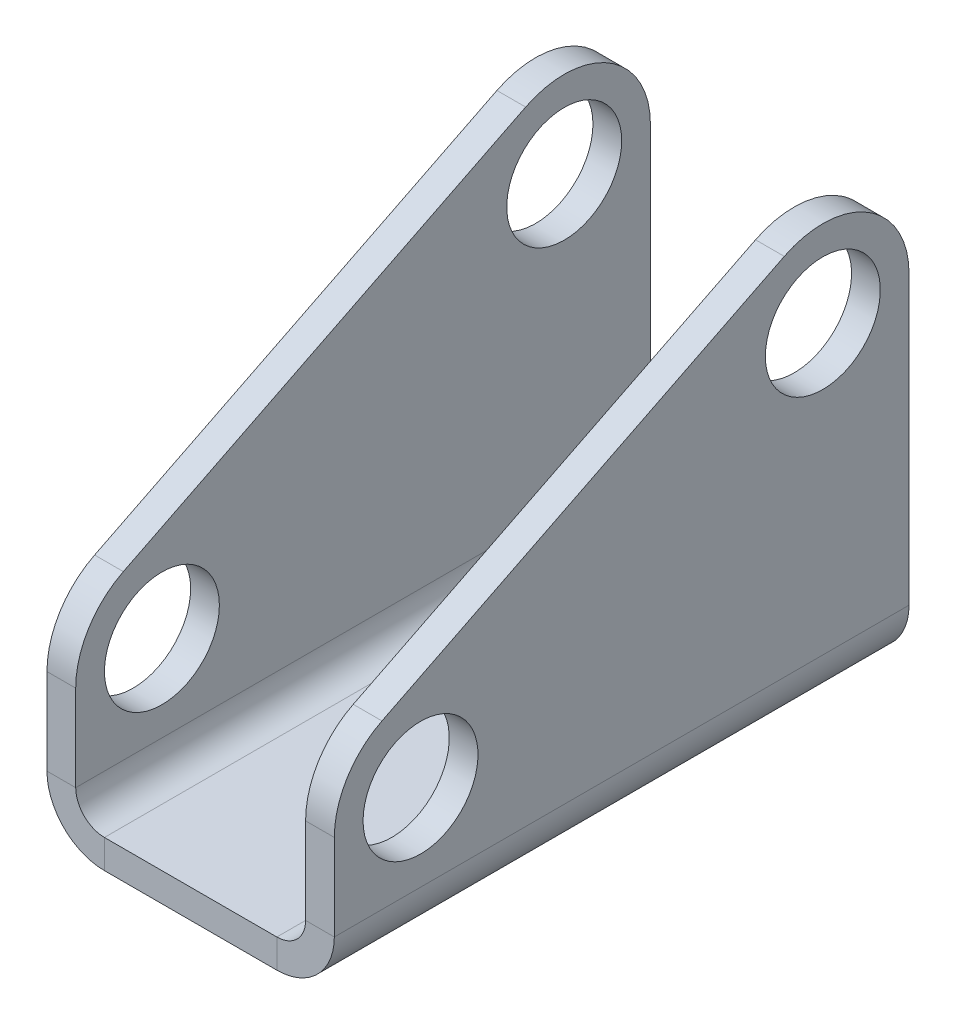
ISO-10303-21;
HEADER;
FILE_DESCRIPTION(('STEP AP214'),'2;1');
FILE_NAME('part.step','',(''),(''),'','','');
FILE_SCHEMA(('AUTOMOTIVE_DESIGN { 1 0 10303 214 1 1 1 1 }'));
ENDSEC;
DATA;
#1=APPLICATION_CONTEXT('core data for automotive mechanical design processes');
#2=APPLICATION_PROTOCOL_DEFINITION('international standard','automotive_design',2000,#1);
#3=PRODUCT_CONTEXT('',#1,'mechanical');
#4=PRODUCT('Part','Part','',(#3));
#5=PRODUCT_RELATED_PRODUCT_CATEGORY('part','',(#4));
#6=PRODUCT_DEFINITION_FORMATION('','',#4);
#7=PRODUCT_DEFINITION_CONTEXT('part definition',#1,'design');
#8=PRODUCT_DEFINITION('design','',#6,#7);
#9=PRODUCT_DEFINITION_SHAPE('','',#8);
#10=(LENGTH_UNIT() NAMED_UNIT(*) SI_UNIT(.MILLI.,.METRE.));
#11=(NAMED_UNIT(*) PLANE_ANGLE_UNIT() SI_UNIT($,.RADIAN.));
#12=(NAMED_UNIT(*) SI_UNIT($,.STERADIAN.) SOLID_ANGLE_UNIT());
#13=UNCERTAINTY_MEASURE_WITH_UNIT(LENGTH_MEASURE(1.E-05),#10,'distance_accuracy_value','');
#14=(GEOMETRIC_REPRESENTATION_CONTEXT(3) GLOBAL_UNCERTAINTY_ASSIGNED_CONTEXT((#13)) GLOBAL_UNIT_ASSIGNED_CONTEXT((#10,
#11,#12)) REPRESENTATION_CONTEXT('',''));
#15=CARTESIAN_POINT('',(0.,0.,0.));
#16=DIRECTION('',(0.,0.,1.));
#17=DIRECTION('',(1.,0.,0.));
#18=AXIS2_PLACEMENT_3D('',#15,#16,#17);
#19=CARTESIAN_POINT('',(1.42857142857143,-4.77832512315271,20.));
#20=DIRECTION('',(-1.,0.,0.));
#21=DIRECTION('',(0.,0.,1.));
#22=AXIS2_PLACEMENT_3D('',#19,#20,#21);
#23=PLANE('',#22);
#24=CARTESIAN_POINT('',(1.42857142857143,7.22167487684729,3.));
#25=DIRECTION('',(-1.,0.,0.));
#26=DIRECTION('',(0.,0.,1.));
#27=AXIS2_PLACEMENT_3D('',#24,#25,#26);
#28=CIRCLE('',#27,2.);
#29=CARTESIAN_POINT('',(1.42857142857143,7.22167487684729,5.));
#30=VERTEX_POINT('',#29);
#31=EDGE_CURVE('E181',#30,#30,#28,.T.);
#32=ORIENTED_EDGE('',*,*,#31,.T.);
#33=EDGE_LOOP('',(#32));
#34=FACE_BOUND('',#33,.T.);
#35=CARTESIAN_POINT('',(1.42857142857143,0.221674876847287,17.));
#36=DIRECTION('',(-1.,0.,0.));
#37=DIRECTION('',(0.,0.,1.));
#38=AXIS2_PLACEMENT_3D('',#35,#36,#37);
#39=CIRCLE('',#38,2.);
#40=CARTESIAN_POINT('',(1.42857142857143,0.221674876847287,19.));
#41=VERTEX_POINT('',#40);
#42=EDGE_CURVE('E293',#41,#41,#39,.T.);
#43=ORIENTED_EDGE('',*,*,#42,.T.);
#44=EDGE_LOOP('',(#43));
#45=FACE_BOUND('',#44,.T.);
#46=DIRECTION('',(0.,1.,0.));
#47=VECTOR('',#46,1.);
#48=CARTESIAN_POINT('',(1.42857142857143,-4.77832512315271,0.));
#49=LINE('',#48,#47);
#50=CARTESIAN_POINT('',(1.42857142857143,-2.77832512315271,0.));
#51=VERTEX_POINT('',#50);
#52=CARTESIAN_POINT('',(1.42857142857143,7.22167487684728,0.));
#53=VERTEX_POINT('',#52);
#54=EDGE_CURVE('E172',#51,#53,#49,.T.);
#55=ORIENTED_EDGE('',*,*,#54,.T.);
#56=CARTESIAN_POINT('',(1.42857142857143,7.22167487684729,3.));
#57=DIRECTION('',(-1.,0.,0.));
#58=DIRECTION('',(0.,0.,1.));
#59=AXIS2_PLACEMENT_3D('',#56,#57,#58);
#60=CIRCLE('',#59,3.);
#61=CARTESIAN_POINT('',(1.42857142857143,9.90495644984703,4.34164078649988));
#62=VERTEX_POINT('',#61);
#63=EDGE_CURVE('E156',#53,#62,#60,.F.);
#64=ORIENTED_EDGE('',*,*,#63,.T.);
#65=DIRECTION('',(0.,-0.447213595499958,0.894427190999916));
#66=VECTOR('',#65,1.);
#67=CARTESIAN_POINT('',(1.42857142857143,0.704956449847035,22.7416407864999));
#68=LINE('',#67,#66);
#69=CARTESIAN_POINT('',(1.42857142857143,2.90495644984704,18.3416407864999));
#70=VERTEX_POINT('',#69);
#71=EDGE_CURVE('E320',#62,#70,#68,.T.);
#72=ORIENTED_EDGE('',*,*,#71,.T.);
#73=CARTESIAN_POINT('',(1.42857142857143,0.221674876847287,17.));
#74=DIRECTION('',(-1.,0.,0.));
#75=DIRECTION('',(0.,0.,1.));
#76=AXIS2_PLACEMENT_3D('',#73,#74,#75);
#77=CIRCLE('',#76,3.);
#78=CARTESIAN_POINT('',(1.42857142857143,0.221674876847287,20.));
#79=VERTEX_POINT('',#78);
#80=EDGE_CURVE('E167',#70,#79,#77,.F.);
#81=ORIENTED_EDGE('',*,*,#80,.T.);
#82=DIRECTION('',(0.,1.,0.));
#83=VECTOR('',#82,1.);
#84=CARTESIAN_POINT('',(1.42857142857143,-4.77832512315271,20.));
#85=LINE('',#84,#83);
#86=CARTESIAN_POINT('',(1.42857142857143,-2.77832512315271,20.));
#87=VERTEX_POINT('',#86);
#88=EDGE_CURVE('E213',#87,#79,#85,.T.);
#89=ORIENTED_EDGE('',*,*,#88,.F.);
#90=DIRECTION('',(0.,0.,-1.));
#91=VECTOR('',#90,1.);
#92=CARTESIAN_POINT('',(1.42857142857143,-2.77832512315271,20.));
#93=LINE('',#92,#91);
#94=EDGE_CURVE('E180',#87,#51,#93,.T.);
#95=ORIENTED_EDGE('',*,*,#94,.T.);
#96=EDGE_LOOP('',(#55,#64,#72,#81,#89,#95));
#97=FACE_BOUND('',#96,.T.);
#98=ADVANCED_FACE('F41',(#34,#45,#97),#23,.F.);
#99=CARTESIAN_POINT('',(0.428571428571432,-4.77832512315271,20.));
#100=DIRECTION('',(-1.,0.,0.));
#101=DIRECTION('',(0.,0.,1.));
#102=AXIS2_PLACEMENT_3D('',#99,#100,#101);
#103=PLANE('',#102);
#104=CARTESIAN_POINT('',(0.428571428571433,0.221674876847287,17.));
#105=DIRECTION('',(-1.,0.,0.));
#106=DIRECTION('',(0.,0.,1.));
#107=AXIS2_PLACEMENT_3D('',#104,#105,#106);
#108=CIRCLE('',#107,2.);
#109=CARTESIAN_POINT('',(0.428571428571433,0.221674876847287,19.));
#110=VERTEX_POINT('',#109);
#111=EDGE_CURVE('E302',#110,#110,#108,.T.);
#112=ORIENTED_EDGE('',*,*,#111,.F.);
#113=EDGE_LOOP('',(#112));
#114=FACE_BOUND('',#113,.T.);
#115=CARTESIAN_POINT('',(0.428571428571433,7.22167487684729,3.));
#116=DIRECTION('',(-1.,0.,0.));
#117=DIRECTION('',(0.,0.,1.));
#118=AXIS2_PLACEMENT_3D('',#115,#116,#117);
#119=CIRCLE('',#118,2.);
#120=CARTESIAN_POINT('',(0.428571428571433,7.22167487684729,5.));
#121=VERTEX_POINT('',#120);
#122=EDGE_CURVE('E186',#121,#121,#119,.T.);
#123=ORIENTED_EDGE('',*,*,#122,.F.);
#124=EDGE_LOOP('',(#123));
#125=FACE_BOUND('',#124,.T.);
#126=CARTESIAN_POINT('',(0.428571428571433,7.22167487684729,3.));
#127=DIRECTION('',(-1.,0.,0.));
#128=DIRECTION('',(0.,0.,1.));
#129=AXIS2_PLACEMENT_3D('',#126,#127,#128);
#130=CIRCLE('',#129,3.);
#131=CARTESIAN_POINT('',(0.428571428571433,7.22167487684728,0.));
#132=VERTEX_POINT('',#131);
#133=CARTESIAN_POINT('',(0.428571428571433,9.90495644984704,4.34164078649987));
#134=VERTEX_POINT('',#133);
#135=EDGE_CURVE('E318',#132,#134,#130,.F.);
#136=ORIENTED_EDGE('',*,*,#135,.F.);
#137=DIRECTION('',(0.,1.,0.));
#138=VECTOR('',#137,1.);
#139=CARTESIAN_POINT('',(0.428571428571432,-4.77832512315271,0.));
#140=LINE('',#139,#138);
#141=CARTESIAN_POINT('',(0.428571428571432,-2.77832512315271,0.));
#142=VERTEX_POINT('',#141);
#143=EDGE_CURVE('E174',#142,#132,#140,.T.);
#144=ORIENTED_EDGE('',*,*,#143,.F.);
#145=DIRECTION('',(0.,0.,-1.));
#146=VECTOR('',#145,1.);
#147=CARTESIAN_POINT('',(0.428571428571432,-2.77832512315271,20.));
#148=LINE('',#147,#146);
#149=CARTESIAN_POINT('',(0.428571428571432,-2.77832512315271,20.));
#150=VERTEX_POINT('',#149);
#151=EDGE_CURVE('E233',#150,#142,#148,.T.);
#152=ORIENTED_EDGE('',*,*,#151,.F.);
#153=DIRECTION('',(0.,1.,0.));
#154=VECTOR('',#153,1.);
#155=CARTESIAN_POINT('',(0.428571428571432,-4.77832512315271,20.));
#156=LINE('',#155,#154);
#157=CARTESIAN_POINT('',(0.428571428571432,0.221674876847287,20.));
#158=VERTEX_POINT('',#157);
#159=EDGE_CURVE('E287',#150,#158,#156,.T.);
#160=ORIENTED_EDGE('',*,*,#159,.T.);
#161=CARTESIAN_POINT('',(0.428571428571433,0.221674876847287,17.));
#162=DIRECTION('',(-1.,0.,0.));
#163=DIRECTION('',(0.,0.,1.));
#164=AXIS2_PLACEMENT_3D('',#161,#162,#163);
#165=CIRCLE('',#164,3.);
#166=CARTESIAN_POINT('',(0.428571428571433,2.90495644984704,18.3416407864999));
#167=VERTEX_POINT('',#166);
#168=EDGE_CURVE('E64',#167,#158,#165,.F.);
#169=ORIENTED_EDGE('',*,*,#168,.F.);
#170=DIRECTION('',(0.,-0.447213595499958,0.894427190999916));
#171=VECTOR('',#170,1.);
#172=CARTESIAN_POINT('',(0.428571428571432,0.704956449847035,22.7416407864999));
#173=LINE('',#172,#171);
#174=EDGE_CURVE('E322',#134,#167,#173,.T.);
#175=ORIENTED_EDGE('',*,*,#174,.F.);
#176=EDGE_LOOP('',(#136,#144,#152,#160,#169,#175));
#177=FACE_BOUND('',#176,.T.);
#178=ADVANCED_FACE('F394',(#114,#125,#177),#103,.T.);
#179=CARTESIAN_POINT('',(-7.57142857142857,10.2216748768473,20.));
#180=DIRECTION('',(1.,0.,0.));
#181=DIRECTION('',(0.,0.,-1.));
#182=AXIS2_PLACEMENT_3D('',#179,#180,#181);
#183=PLANE('',#182);
#184=CARTESIAN_POINT('',(-7.57142857142857,0.221674876847287,17.));
#185=DIRECTION('',(1.,0.,0.));
#186=DIRECTION('',(0.,0.,-1.));
#187=AXIS2_PLACEMENT_3D('',#184,#185,#186);
#188=CIRCLE('',#187,2.);
#189=CARTESIAN_POINT('',(-7.57142857142857,0.221674876847287,15.));
#190=VERTEX_POINT('',#189);
#191=EDGE_CURVE('E307',#190,#190,#188,.T.);
#192=ORIENTED_EDGE('',*,*,#191,.F.);
#193=EDGE_LOOP('',(#192));
#194=FACE_BOUND('',#193,.T.);
#195=CARTESIAN_POINT('',(-7.57142857142857,7.22167487684729,3.));
#196=DIRECTION('',(1.,0.,0.));
#197=DIRECTION('',(0.,0.,-1.));
#198=AXIS2_PLACEMENT_3D('',#195,#196,#197);
#199=CIRCLE('',#198,2.);
#200=CARTESIAN_POINT('',(-7.57142857142857,7.22167487684729,1.));
#201=VERTEX_POINT('',#200);
#202=EDGE_CURVE('E295',#201,#201,#199,.T.);
#203=ORIENTED_EDGE('',*,*,#202,.F.);
#204=EDGE_LOOP('',(#203));
#205=FACE_BOUND('',#204,.T.);
#206=DIRECTION('',(0.,1.,0.));
#207=VECTOR('',#206,1.);
#208=CARTESIAN_POINT('',(-7.57142857142857,10.2216748768473,0.));
#209=LINE('',#208,#207);
#210=CARTESIAN_POINT('',(-7.57142857142857,7.22167487684728,0.));
#211=VERTEX_POINT('',#210);
#212=CARTESIAN_POINT('',(-7.57142857142857,-2.77832512315271,0.));
#213=VERTEX_POINT('',#212);
#214=EDGE_CURVE('E200',#211,#213,#209,.F.);
#215=ORIENTED_EDGE('',*,*,#214,.F.);
#216=CARTESIAN_POINT('',(-7.57142857142857,7.22167487684729,3.));
#217=DIRECTION('',(1.,0.,0.));
#218=DIRECTION('',(0.,0.,-1.));
#219=AXIS2_PLACEMENT_3D('',#216,#217,#218);
#220=CIRCLE('',#219,3.);
#221=CARTESIAN_POINT('',(-7.57142857142857,9.90495644984704,4.34164078649987));
#222=VERTEX_POINT('',#221);
#223=EDGE_CURVE('E335',#222,#211,#220,.F.);
#224=ORIENTED_EDGE('',*,*,#223,.F.);
#225=DIRECTION('',(0.,0.447213595499958,-0.894427190999916));
#226=VECTOR('',#225,1.);
#227=CARTESIAN_POINT('',(-7.57142857142857,3.70495644984704,16.7416407864999));
#228=LINE('',#227,#226);
#229=CARTESIAN_POINT('',(-7.57142857142857,2.90495644984704,18.3416407864999));
#230=VERTEX_POINT('',#229);
#231=EDGE_CURVE('E338',#230,#222,#228,.T.);
#232=ORIENTED_EDGE('',*,*,#231,.F.);
#233=CARTESIAN_POINT('',(-7.57142857142857,0.221674876847287,17.));
#234=DIRECTION('',(1.,0.,0.));
#235=DIRECTION('',(0.,0.,-1.));
#236=AXIS2_PLACEMENT_3D('',#233,#234,#235);
#237=CIRCLE('',#236,3.);
#238=CARTESIAN_POINT('',(-7.57142857142857,0.221674876847287,20.));
#239=VERTEX_POINT('',#238);
#240=EDGE_CURVE('E316',#239,#230,#237,.F.);
#241=ORIENTED_EDGE('',*,*,#240,.F.);
#242=DIRECTION('',(0.,1.,0.));
#243=VECTOR('',#242,1.);
#244=CARTESIAN_POINT('',(-7.57142857142857,10.2216748768473,20.));
#245=LINE('',#244,#243);
#246=CARTESIAN_POINT('',(-7.57142857142857,-2.77832512315271,20.));
#247=VERTEX_POINT('',#246);
#248=EDGE_CURVE('E279',#239,#247,#245,.F.);
#249=ORIENTED_EDGE('',*,*,#248,.T.);
#250=DIRECTION('',(0.,0.,-1.));
#251=VECTOR('',#250,1.);
#252=CARTESIAN_POINT('',(-7.57142857142857,-2.77832512315271,20.));
#253=LINE('',#252,#251);
#254=EDGE_CURVE('E224',#247,#213,#253,.T.);
#255=ORIENTED_EDGE('',*,*,#254,.T.);
#256=EDGE_LOOP('',(#215,#224,#232,#241,#249,#255));
#257=FACE_BOUND('',#256,.T.);
#258=ADVANCED_FACE('F365',(#194,#205,#257),#183,.T.);
#259=CARTESIAN_POINT('',(-8.57142857142857,10.2216748768473,20.));
#260=DIRECTION('',(1.,0.,0.));
#261=DIRECTION('',(0.,0.,-1.));
#262=AXIS2_PLACEMENT_3D('',#259,#260,#261);
#263=PLANE('',#262);
#264=CARTESIAN_POINT('',(-8.57142857142857,7.22167487684729,3.));
#265=DIRECTION('',(1.,0.,0.));
#266=DIRECTION('',(0.,0.,-1.));
#267=AXIS2_PLACEMENT_3D('',#264,#265,#266);
#268=CIRCLE('',#267,2.);
#269=CARTESIAN_POINT('',(-8.57142857142857,7.22167487684729,1.));
#270=VERTEX_POINT('',#269);
#271=EDGE_CURVE('E298',#270,#270,#268,.T.);
#272=ORIENTED_EDGE('',*,*,#271,.T.);
#273=EDGE_LOOP('',(#272));
#274=FACE_BOUND('',#273,.T.);
#275=CARTESIAN_POINT('',(-8.57142857142857,0.221674876847287,17.));
#276=DIRECTION('',(1.,0.,0.));
#277=DIRECTION('',(0.,0.,-1.));
#278=AXIS2_PLACEMENT_3D('',#275,#276,#277);
#279=CIRCLE('',#278,2.);
#280=CARTESIAN_POINT('',(-8.57142857142857,0.221674876847287,15.));
#281=VERTEX_POINT('',#280);
#282=EDGE_CURVE('E299',#281,#281,#279,.T.);
#283=ORIENTED_EDGE('',*,*,#282,.T.);
#284=EDGE_LOOP('',(#283));
#285=FACE_BOUND('',#284,.T.);
#286=CARTESIAN_POINT('',(-8.57142857142857,7.22167487684729,3.));
#287=DIRECTION('',(1.,0.,0.));
#288=DIRECTION('',(0.,0.,-1.));
#289=AXIS2_PLACEMENT_3D('',#286,#287,#288);
#290=CIRCLE('',#289,3.);
#291=CARTESIAN_POINT('',(-8.57142857142857,9.90495644984704,4.34164078649988));
#292=VERTEX_POINT('',#291);
#293=CARTESIAN_POINT('',(-8.57142857142857,7.22167487684728,0.));
#294=VERTEX_POINT('',#293);
#295=EDGE_CURVE('E331',#292,#294,#290,.F.);
#296=ORIENTED_EDGE('',*,*,#295,.T.);
#297=DIRECTION('',(0.,-1.,0.));
#298=VECTOR('',#297,1.);
#299=CARTESIAN_POINT('',(-8.57142857142857,10.2216748768473,0.));
#300=LINE('',#299,#298);
#301=CARTESIAN_POINT('',(-8.57142857142857,-2.77832512315271,0.));
#302=VERTEX_POINT('',#301);
#303=EDGE_CURVE('E202',#294,#302,#300,.T.);
#304=ORIENTED_EDGE('',*,*,#303,.T.);
#305=DIRECTION('',(0.,0.,-1.));
#306=VECTOR('',#305,1.);
#307=CARTESIAN_POINT('',(-8.57142857142857,-2.77832512315271,20.));
#308=LINE('',#307,#306);
#309=CARTESIAN_POINT('',(-8.57142857142857,-2.77832512315271,20.));
#310=VERTEX_POINT('',#309);
#311=EDGE_CURVE('E221',#310,#302,#308,.T.);
#312=ORIENTED_EDGE('',*,*,#311,.F.);
#313=DIRECTION('',(0.,-1.,0.));
#314=VECTOR('',#313,1.);
#315=CARTESIAN_POINT('',(-8.57142857142857,10.2216748768473,20.));
#316=LINE('',#315,#314);
#317=CARTESIAN_POINT('',(-8.57142857142857,0.221674876847287,20.));
#318=VERTEX_POINT('',#317);
#319=EDGE_CURVE('E268',#318,#310,#316,.T.);
#320=ORIENTED_EDGE('',*,*,#319,.F.);
#321=CARTESIAN_POINT('',(-8.57142857142857,0.221674876847287,17.));
#322=DIRECTION('',(1.,0.,0.));
#323=DIRECTION('',(0.,0.,-1.));
#324=AXIS2_PLACEMENT_3D('',#321,#322,#323);
#325=CIRCLE('',#324,3.);
#326=CARTESIAN_POINT('',(-8.57142857142857,2.90495644984703,18.3416407864999));
#327=VERTEX_POINT('',#326);
#328=EDGE_CURVE('E337',#318,#327,#325,.F.);
#329=ORIENTED_EDGE('',*,*,#328,.T.);
#330=DIRECTION('',(0.,0.447213595499958,-0.894427190999916));
#331=VECTOR('',#330,1.);
#332=CARTESIAN_POINT('',(-8.57142857142857,3.70495644984704,16.7416407864999));
#333=LINE('',#332,#331);
#334=EDGE_CURVE('E343',#327,#292,#333,.T.);
#335=ORIENTED_EDGE('',*,*,#334,.T.);
#336=EDGE_LOOP('',(#296,#304,#312,#320,#329,#335));
#337=FACE_BOUND('',#336,.T.);
#338=ADVANCED_FACE('F359',(#274,#285,#337),#263,.F.);
#339=CARTESIAN_POINT('',(-0.571428571428568,-2.77832512315271,20.));
#340=DIRECTION('',(0.,0.,1.));
#341=DIRECTION('',(1.,0.,0.));
#342=AXIS2_PLACEMENT_3D('',#339,#340,#341);
#343=PLANE('',#342);
#344=ORIENTED_EDGE('',*,*,#88,.T.);
#345=DIRECTION('',(-1.,0.,0.));
#346=VECTOR('',#345,1.);
#347=CARTESIAN_POINT('',(0.428571428571432,0.221674876847287,20.));
#348=LINE('',#347,#346);
#349=EDGE_CURVE('E314',#158,#79,#348,.F.);
#350=ORIENTED_EDGE('',*,*,#349,.F.);
#351=ORIENTED_EDGE('',*,*,#159,.F.);
#352=DIRECTION('',(1.,0.,0.));
#353=VECTOR('',#352,1.);
#354=CARTESIAN_POINT('',(0.428571428571432,-2.77832512315271,20.));
#355=LINE('',#354,#353);
#356=EDGE_CURVE('E240',#150,#87,#355,.T.);
#357=ORIENTED_EDGE('',*,*,#356,.T.);
#358=EDGE_LOOP('',(#344,#350,#351,#357));
#359=FACE_BOUND('',#358,.T.);
#360=ADVANCED_FACE('F395',(#359),#343,.T.);
#361=CARTESIAN_POINT('',(-8.57142857142857,-2.77832512315271,20.));
#362=DIRECTION('',(0.,0.,1.));
#363=DIRECTION('',(1.,0.,0.));
#364=AXIS2_PLACEMENT_3D('',#361,#362,#363);
#365=PLANE('',#364);
#366=DIRECTION('',(1.,0.,0.));
#367=VECTOR('',#366,1.);
#368=CARTESIAN_POINT('',(-8.57142857142857,-2.77832512315271,20.));
#369=LINE('',#368,#367);
#370=EDGE_CURVE('E11',#310,#247,#369,.T.);
#371=ORIENTED_EDGE('',*,*,#370,.F.);
#372=CARTESIAN_POINT('',(-6.57142857142857,-2.77832512315271,20.));
#373=DIRECTION('',(0.,0.,-1.));
#374=DIRECTION('',(-1.,0.,0.));
#375=AXIS2_PLACEMENT_3D('',#372,#373,#374);
#376=CIRCLE('',#375,2.);
#377=CARTESIAN_POINT('',(-6.57142857142857,-4.77832512315271,20.));
#378=VERTEX_POINT('',#377);
#379=EDGE_CURVE('E264',#310,#378,#376,.F.);
#380=ORIENTED_EDGE('',*,*,#379,.T.);
#381=DIRECTION('',(0.,-1.,0.));
#382=VECTOR('',#381,1.);
#383=CARTESIAN_POINT('',(-6.57142857142857,-3.77832512315271,20.));
#384=LINE('',#383,#382);
#385=CARTESIAN_POINT('',(-6.57142857142857,-3.77832512315271,20.));
#386=VERTEX_POINT('',#385);
#387=EDGE_CURVE('E49',#386,#378,#384,.T.);
#388=ORIENTED_EDGE('',*,*,#387,.F.);
#389=CARTESIAN_POINT('',(-6.57142857142857,-2.77832512315271,20.));
#390=DIRECTION('',(0.,0.,1.));
#391=DIRECTION('',(1.,0.,0.));
#392=AXIS2_PLACEMENT_3D('',#389,#390,#391);
#393=CIRCLE('',#392,1.);
#394=EDGE_CURVE('E281',#247,#386,#393,.T.);
#395=ORIENTED_EDGE('',*,*,#394,.F.);
#396=EDGE_LOOP('',(#371,#380,#388,#395));
#397=FACE_BOUND('',#396,.T.);
#398=ADVANCED_FACE('F43',(#397),#365,.T.);
#399=CARTESIAN_POINT('',(-6.57142857142857,-3.77832512315271,20.));
#400=DIRECTION('',(0.,0.,1.));
#401=DIRECTION('',(1.,0.,0.));
#402=AXIS2_PLACEMENT_3D('',#399,#400,#401);
#403=PLANE('',#402);
#404=DIRECTION('',(1.,0.,0.));
#405=VECTOR('',#404,1.);
#406=CARTESIAN_POINT('',(-7.57142857142857,0.221674876847287,20.));
#407=LINE('',#406,#405);
#408=EDGE_CURVE('E327',#239,#318,#407,.F.);
#409=ORIENTED_EDGE('',*,*,#408,.T.);
#410=ORIENTED_EDGE('',*,*,#319,.T.);
#411=ORIENTED_EDGE('',*,*,#370,.T.);
#412=ORIENTED_EDGE('',*,*,#248,.F.);
#413=EDGE_LOOP('',(#409,#410,#411,#412));
#414=FACE_BOUND('',#413,.T.);
#415=ADVANCED_FACE('F433',(#414),#403,.T.);
#416=CARTESIAN_POINT('',(-6.57142857142857,-4.77832512315271,0.));
#417=DIRECTION('',(0.,0.,-1.));
#418=DIRECTION('',(-1.,0.,0.));
#419=AXIS2_PLACEMENT_3D('',#416,#417,#418);
#420=PLANE('',#419);
#421=DIRECTION('',(0.,1.,0.));
#422=VECTOR('',#421,1.);
#423=CARTESIAN_POINT('',(-6.57142857142857,-4.77832512315271,0.));
#424=LINE('',#423,#422);
#425=CARTESIAN_POINT('',(-6.57142857142857,-4.77832512315271,0.));
#426=VERTEX_POINT('',#425);
#427=CARTESIAN_POINT('',(-6.57142857142857,-3.77832512315271,0.));
#428=VERTEX_POINT('',#427);
#429=EDGE_CURVE('E247',#426,#428,#424,.T.);
#430=ORIENTED_EDGE('',*,*,#429,.F.);
#431=CARTESIAN_POINT('',(-6.57142857142857,-2.77832512315271,0.));
#432=DIRECTION('',(0.,0.,-1.));
#433=DIRECTION('',(-1.,0.,0.));
#434=AXIS2_PLACEMENT_3D('',#431,#432,#433);
#435=CIRCLE('',#434,2.);
#436=EDGE_CURVE('E204',#302,#426,#435,.F.);
#437=ORIENTED_EDGE('',*,*,#436,.F.);
#438=DIRECTION('',(-1.,0.,0.));
#439=VECTOR('',#438,1.);
#440=CARTESIAN_POINT('',(-7.57142857142857,-2.77832512315271,0.));
#441=LINE('',#440,#439);
#442=EDGE_CURVE('E244',#213,#302,#441,.T.);
#443=ORIENTED_EDGE('',*,*,#442,.F.);
#444=CARTESIAN_POINT('',(-6.57142857142857,-2.77832512315271,0.));
#445=DIRECTION('',(0.,0.,1.));
#446=DIRECTION('',(1.,0.,0.));
#447=AXIS2_PLACEMENT_3D('',#444,#445,#446);
#448=CIRCLE('',#447,1.);
#449=EDGE_CURVE('E197',#213,#428,#448,.T.);
#450=ORIENTED_EDGE('',*,*,#449,.T.);
#451=EDGE_LOOP('',(#430,#437,#443,#450));
#452=FACE_BOUND('',#451,.T.);
#453=ADVANCED_FACE('F370',(#452),#420,.T.);
#454=CARTESIAN_POINT('',(-7.57142857142857,-2.77832512315271,0.));
#455=DIRECTION('',(0.,0.,-1.));
#456=DIRECTION('',(-1.,0.,0.));
#457=AXIS2_PLACEMENT_3D('',#454,#455,#456);
#458=PLANE('',#457);
#459=DIRECTION('',(1.,0.,0.));
#460=VECTOR('',#459,1.);
#461=CARTESIAN_POINT('',(-8.57142857142857,-4.77832512315271,0.));
#462=LINE('',#461,#460);
#463=CARTESIAN_POINT('',(-0.571428571428568,-4.77832512315271,0.));
#464=VERTEX_POINT('',#463);
#465=EDGE_CURVE('E207',#426,#464,#462,.T.);
#466=ORIENTED_EDGE('',*,*,#465,.F.);
#467=ORIENTED_EDGE('',*,*,#429,.T.);
#468=DIRECTION('',(1.,0.,0.));
#469=VECTOR('',#468,1.);
#470=CARTESIAN_POINT('',(-8.57142857142857,-3.77832512315271,0.));
#471=LINE('',#470,#469);
#472=CARTESIAN_POINT('',(-0.571428571428568,-3.77832512315271,0.));
#473=VERTEX_POINT('',#472);
#474=EDGE_CURVE('E194',#428,#473,#471,.T.);
#475=ORIENTED_EDGE('',*,*,#474,.T.);
#476=DIRECTION('',(0.,-1.,0.));
#477=VECTOR('',#476,1.);
#478=CARTESIAN_POINT('',(-0.571428571428568,-3.77832512315271,0.));
#479=LINE('',#478,#477);
#480=EDGE_CURVE('E236',#473,#464,#479,.T.);
#481=ORIENTED_EDGE('',*,*,#480,.T.);
#482=EDGE_LOOP('',(#466,#467,#475,#481));
#483=FACE_BOUND('',#482,.T.);
#484=ADVANCED_FACE('F372',(#483),#458,.T.);
#485=CARTESIAN_POINT('',(-0.571428571428568,-4.77832512315271,20.));
#486=DIRECTION('',(0.,0.,1.));
#487=DIRECTION('',(1.,0.,0.));
#488=AXIS2_PLACEMENT_3D('',#485,#486,#487);
#489=PLANE('',#488);
#490=DIRECTION('',(0.,1.,0.));
#491=VECTOR('',#490,1.);
#492=CARTESIAN_POINT('',(-0.571428571428568,-4.77832512315271,20.));
#493=LINE('',#492,#491);
#494=CARTESIAN_POINT('',(-0.571428571428568,-4.77832512315271,20.));
#495=VERTEX_POINT('',#494);
#496=CARTESIAN_POINT('',(-0.571428571428568,-3.77832512315271,20.));
#497=VERTEX_POINT('',#496);
#498=EDGE_CURVE('E242',#495,#497,#493,.T.);
#499=ORIENTED_EDGE('',*,*,#498,.F.);
#500=CARTESIAN_POINT('',(-0.571428571428568,-2.77832512315271,20.));
#501=DIRECTION('',(0.,0.,-1.));
#502=DIRECTION('',(-1.,0.,0.));
#503=AXIS2_PLACEMENT_3D('',#500,#501,#502);
#504=CIRCLE('',#503,2.);
#505=EDGE_CURVE('E189',#495,#87,#504,.F.);
#506=ORIENTED_EDGE('',*,*,#505,.T.);
#507=ORIENTED_EDGE('',*,*,#356,.F.);
#508=CARTESIAN_POINT('',(-0.571428571428568,-2.77832512315271,20.));
#509=DIRECTION('',(0.,0.,1.));
#510=DIRECTION('',(1.,0.,0.));
#511=AXIS2_PLACEMENT_3D('',#508,#509,#510);
#512=CIRCLE('',#511,1.);
#513=EDGE_CURVE('E284',#497,#150,#512,.T.);
#514=ORIENTED_EDGE('',*,*,#513,.F.);
#515=EDGE_LOOP('',(#499,#506,#507,#514));
#516=FACE_BOUND('',#515,.T.);
#517=ADVANCED_FACE('F390',(#516),#489,.T.);
#518=CARTESIAN_POINT('',(0.428571428571432,-2.77832512315271,20.));
#519=DIRECTION('',(0.,0.,1.));
#520=DIRECTION('',(1.,0.,0.));
#521=AXIS2_PLACEMENT_3D('',#518,#519,#520);
#522=PLANE('',#521);
#523=DIRECTION('',(1.,0.,0.));
#524=VECTOR('',#523,1.);
#525=CARTESIAN_POINT('',(-8.57142857142857,-4.77832512315271,20.));
#526=LINE('',#525,#524);
#527=EDGE_CURVE('E254',#378,#495,#526,.T.);
#528=ORIENTED_EDGE('',*,*,#527,.T.);
#529=ORIENTED_EDGE('',*,*,#498,.T.);
#530=DIRECTION('',(1.,0.,0.));
#531=VECTOR('',#530,1.);
#532=CARTESIAN_POINT('',(-8.57142857142857,-3.77832512315271,20.));
#533=LINE('',#532,#531);
#534=EDGE_CURVE('E257',#386,#497,#533,.T.);
#535=ORIENTED_EDGE('',*,*,#534,.F.);
#536=ORIENTED_EDGE('',*,*,#387,.T.);
#537=EDGE_LOOP('',(#528,#529,#535,#536));
#538=FACE_BOUND('',#537,.T.);
#539=ADVANCED_FACE('F252',(#538),#522,.T.);
#540=CARTESIAN_POINT('',(1.42857142857143,-2.77832512315271,0.));
#541=DIRECTION('',(0.,0.,-1.));
#542=DIRECTION('',(-1.,0.,0.));
#543=AXIS2_PLACEMENT_3D('',#540,#541,#542);
#544=PLANE('',#543);
#545=DIRECTION('',(-1.,0.,0.));
#546=VECTOR('',#545,1.);
#547=CARTESIAN_POINT('',(1.42857142857143,-2.77832512315271,0.));
#548=LINE('',#547,#546);
#549=EDGE_CURVE('E238',#51,#142,#548,.T.);
#550=ORIENTED_EDGE('',*,*,#549,.F.);
#551=CARTESIAN_POINT('',(-0.571428571428568,-2.77832512315271,0.));
#552=DIRECTION('',(0.,0.,-1.));
#553=DIRECTION('',(-1.,0.,0.));
#554=AXIS2_PLACEMENT_3D('',#551,#552,#553);
#555=CIRCLE('',#554,2.);
#556=EDGE_CURVE('E210',#464,#51,#555,.F.);
#557=ORIENTED_EDGE('',*,*,#556,.F.);
#558=ORIENTED_EDGE('',*,*,#480,.F.);
#559=CARTESIAN_POINT('',(-0.571428571428568,-2.77832512315271,0.));
#560=DIRECTION('',(0.,0.,1.));
#561=DIRECTION('',(1.,0.,0.));
#562=AXIS2_PLACEMENT_3D('',#559,#560,#561);
#563=CIRCLE('',#562,1.);
#564=EDGE_CURVE('E183',#473,#142,#563,.T.);
#565=ORIENTED_EDGE('',*,*,#564,.T.);
#566=EDGE_LOOP('',(#550,#557,#558,#565));
#567=FACE_BOUND('',#566,.T.);
#568=ADVANCED_FACE('F385',(#567),#544,.T.);
#569=CARTESIAN_POINT('',(-0.571428571428568,-3.77832512315271,0.));
#570=DIRECTION('',(0.,0.,-1.));
#571=DIRECTION('',(-1.,0.,0.));
#572=AXIS2_PLACEMENT_3D('',#569,#570,#571);
#573=PLANE('',#572);
#574=DIRECTION('',(-1.,0.,0.));
#575=VECTOR('',#574,1.);
#576=CARTESIAN_POINT('',(0.428571428571433,7.22167487684728,0.));
#577=LINE('',#576,#575);
#578=EDGE_CURVE('E159',#132,#53,#577,.F.);
#579=ORIENTED_EDGE('',*,*,#578,.T.);
#580=ORIENTED_EDGE('',*,*,#54,.F.);
#581=ORIENTED_EDGE('',*,*,#549,.T.);
#582=ORIENTED_EDGE('',*,*,#143,.T.);
#583=EDGE_LOOP('',(#579,#580,#581,#582));
#584=FACE_BOUND('',#583,.T.);
#585=ADVANCED_FACE('F171',(#584),#573,.T.);
#586=CARTESIAN_POINT('',(-0.571428571428568,-2.77832512315271,20.));
#587=DIRECTION('',(0.,0.,-1.));
#588=DIRECTION('',(-1.,0.,0.));
#589=AXIS2_PLACEMENT_3D('',#586,#587,#588);
#590=CYLINDRICAL_SURFACE('',#589,1.);
#591=ORIENTED_EDGE('',*,*,#564,.F.);
#592=DIRECTION('',(0.,0.,-1.));
#593=VECTOR('',#592,1.);
#594=CARTESIAN_POINT('',(-0.571428571428568,-3.77832512315271,20.));
#595=LINE('',#594,#593);
#596=EDGE_CURVE('E230',#497,#473,#595,.T.);
#597=ORIENTED_EDGE('',*,*,#596,.F.);
#598=ORIENTED_EDGE('',*,*,#513,.T.);
#599=ORIENTED_EDGE('',*,*,#151,.T.);
#600=EDGE_LOOP('',(#591,#597,#598,#599));
#601=FACE_BOUND('',#600,.T.);
#602=ADVANCED_FACE('F382',(#601),#590,.F.);
#603=CARTESIAN_POINT('',(-8.57142857142857,-3.77832512315271,20.));
#604=DIRECTION('',(0.,1.,0.));
#605=DIRECTION('',(0.,0.,1.));
#606=AXIS2_PLACEMENT_3D('',#603,#604,#605);
#607=PLANE('',#606);
#608=ORIENTED_EDGE('',*,*,#474,.F.);
#609=DIRECTION('',(0.,0.,-1.));
#610=VECTOR('',#609,1.);
#611=CARTESIAN_POINT('',(-6.57142857142857,-3.77832512315271,20.));
#612=LINE('',#611,#610);
#613=EDGE_CURVE('E227',#386,#428,#612,.T.);
#614=ORIENTED_EDGE('',*,*,#613,.F.);
#615=ORIENTED_EDGE('',*,*,#534,.T.);
#616=ORIENTED_EDGE('',*,*,#596,.T.);
#617=EDGE_LOOP('',(#608,#614,#615,#616));
#618=FACE_BOUND('',#617,.T.);
#619=ADVANCED_FACE('F377',(#618),#607,.T.);
#620=CARTESIAN_POINT('',(-6.57142857142857,-2.77832512315271,20.));
#621=DIRECTION('',(0.,0.,-1.));
#622=DIRECTION('',(-1.,0.,0.));
#623=AXIS2_PLACEMENT_3D('',#620,#621,#622);
#624=CYLINDRICAL_SURFACE('',#623,1.);
#625=ORIENTED_EDGE('',*,*,#449,.F.);
#626=ORIENTED_EDGE('',*,*,#254,.F.);
#627=ORIENTED_EDGE('',*,*,#394,.T.);
#628=ORIENTED_EDGE('',*,*,#613,.T.);
#629=EDGE_LOOP('',(#625,#626,#627,#628));
#630=FACE_BOUND('',#629,.T.);
#631=ADVANCED_FACE('F375',(#630),#624,.F.);
#632=CARTESIAN_POINT('',(-6.57142857142857,-2.77832512315271,20.));
#633=DIRECTION('',(0.,0.,-1.));
#634=DIRECTION('',(-1.,0.,0.));
#635=AXIS2_PLACEMENT_3D('',#632,#633,#634);
#636=CYLINDRICAL_SURFACE('',#635,2.);
#637=ORIENTED_EDGE('',*,*,#436,.T.);
#638=DIRECTION('',(0.,0.,-1.));
#639=VECTOR('',#638,1.);
#640=CARTESIAN_POINT('',(-6.57142857142857,-4.77832512315271,20.));
#641=LINE('',#640,#639);
#642=EDGE_CURVE('E218',#378,#426,#641,.T.);
#643=ORIENTED_EDGE('',*,*,#642,.F.);
#644=ORIENTED_EDGE('',*,*,#379,.F.);
#645=ORIENTED_EDGE('',*,*,#311,.T.);
#646=EDGE_LOOP('',(#637,#643,#644,#645));
#647=FACE_BOUND('',#646,.T.);
#648=ADVANCED_FACE('F270',(#647),#636,.T.);
#649=CARTESIAN_POINT('',(-8.57142857142857,-4.77832512315271,20.));
#650=DIRECTION('',(0.,1.,0.));
#651=DIRECTION('',(0.,0.,1.));
#652=AXIS2_PLACEMENT_3D('',#649,#650,#651);
#653=PLANE('',#652);
#654=ORIENTED_EDGE('',*,*,#465,.T.);
#655=DIRECTION('',(0.,0.,-1.));
#656=VECTOR('',#655,1.);
#657=CARTESIAN_POINT('',(-0.571428571428568,-4.77832512315271,20.));
#658=LINE('',#657,#656);
#659=EDGE_CURVE('E215',#495,#464,#658,.T.);
#660=ORIENTED_EDGE('',*,*,#659,.F.);
#661=ORIENTED_EDGE('',*,*,#527,.F.);
#662=ORIENTED_EDGE('',*,*,#642,.T.);
#663=EDGE_LOOP('',(#654,#660,#661,#662));
#664=FACE_BOUND('',#663,.T.);
#665=ADVANCED_FACE('F274',(#664),#653,.F.);
#666=CARTESIAN_POINT('',(-0.571428571428568,-2.77832512315271,20.));
#667=DIRECTION('',(0.,0.,-1.));
#668=DIRECTION('',(-1.,0.,0.));
#669=AXIS2_PLACEMENT_3D('',#666,#667,#668);
#670=CYLINDRICAL_SURFACE('',#669,2.);
#671=ORIENTED_EDGE('',*,*,#556,.T.);
#672=ORIENTED_EDGE('',*,*,#94,.F.);
#673=ORIENTED_EDGE('',*,*,#505,.F.);
#674=ORIENTED_EDGE('',*,*,#659,.T.);
#675=EDGE_LOOP('',(#671,#672,#673,#674));
#676=FACE_BOUND('',#675,.T.);
#677=ADVANCED_FACE('F388',(#676),#670,.T.);
#678=CARTESIAN_POINT('',(-0.571428571428568,-2.77832512315271,0.));
#679=DIRECTION('',(0.,0.,1.));
#680=DIRECTION('',(1.,0.,0.));
#681=AXIS2_PLACEMENT_3D('',#678,#679,#680);
#682=PLANE('',#681);
#683=ORIENTED_EDGE('',*,*,#303,.F.);
#684=DIRECTION('',(1.,0.,0.));
#685=VECTOR('',#684,1.);
#686=CARTESIAN_POINT('',(-7.57142857142857,7.22167487684728,0.));
#687=LINE('',#686,#685);
#688=EDGE_CURVE('E175',#211,#294,#687,.F.);
#689=ORIENTED_EDGE('',*,*,#688,.F.);
#690=ORIENTED_EDGE('',*,*,#214,.T.);
#691=ORIENTED_EDGE('',*,*,#442,.T.);
#692=EDGE_LOOP('',(#683,#689,#690,#691));
#693=FACE_BOUND('',#692,.T.);
#694=ADVANCED_FACE('F356',(#693),#682,.F.);
#695=CARTESIAN_POINT('',(0.428571428571433,7.22167487684729,3.));
#696=DIRECTION('',(-1.,0.,0.));
#697=DIRECTION('',(0.,0.,1.));
#698=AXIS2_PLACEMENT_3D('',#695,#696,#697);
#699=CYLINDRICAL_SURFACE('',#698,2.);
#700=ORIENTED_EDGE('',*,*,#31,.F.);
#701=EDGE_LOOP('',(#700));
#702=FACE_BOUND('',#701,.T.);
#703=ORIENTED_EDGE('',*,*,#122,.T.);
#704=EDGE_LOOP('',(#703));
#705=FACE_BOUND('',#704,.T.);
#706=ADVANCED_FACE('F408',(#702,#705),#699,.F.);
#707=CARTESIAN_POINT('',(0.428571428571433,7.22167487684729,3.));
#708=DIRECTION('',(-1.,0.,0.));
#709=DIRECTION('',(0.,0.,1.));
#710=AXIS2_PLACEMENT_3D('',#707,#708,#709);
#711=CYLINDRICAL_SURFACE('',#710,3.);
#712=ORIENTED_EDGE('',*,*,#63,.F.);
#713=ORIENTED_EDGE('',*,*,#578,.F.);
#714=ORIENTED_EDGE('',*,*,#135,.T.);
#715=DIRECTION('',(-1.,0.,0.));
#716=VECTOR('',#715,1.);
#717=CARTESIAN_POINT('',(0.428571428571433,9.90495644984704,4.34164078649987));
#718=LINE('',#717,#716);
#719=EDGE_CURVE('E162',#134,#62,#718,.F.);
#720=ORIENTED_EDGE('',*,*,#719,.T.);
#721=EDGE_LOOP('',(#712,#713,#714,#720));
#722=FACE_BOUND('',#721,.T.);
#723=ADVANCED_FACE('F158',(#722),#711,.T.);
#724=CARTESIAN_POINT('',(0.428571428571432,0.704956449847035,22.7416407864999));
#725=DIRECTION('',(0.,-0.894427190999916,-0.447213595499958));
#726=DIRECTION('',(0.,-0.447213595499958,0.894427190999916));
#727=AXIS2_PLACEMENT_3D('',#724,#725,#726);
#728=PLANE('',#727);
#729=ORIENTED_EDGE('',*,*,#719,.F.);
#730=ORIENTED_EDGE('',*,*,#174,.T.);
#731=DIRECTION('',(-1.,0.,0.));
#732=VECTOR('',#731,1.);
#733=CARTESIAN_POINT('',(0.428571428571433,2.90495644984704,18.3416407864999));
#734=LINE('',#733,#732);
#735=EDGE_CURVE('E166',#167,#70,#734,.F.);
#736=ORIENTED_EDGE('',*,*,#735,.T.);
#737=ORIENTED_EDGE('',*,*,#71,.F.);
#738=EDGE_LOOP('',(#729,#730,#736,#737));
#739=FACE_BOUND('',#738,.T.);
#740=ADVANCED_FACE('F398',(#739),#728,.F.);
#741=CARTESIAN_POINT('',(0.428571428571433,0.221674876847287,17.));
#742=DIRECTION('',(-1.,0.,0.));
#743=DIRECTION('',(0.,0.,1.));
#744=AXIS2_PLACEMENT_3D('',#741,#742,#743);
#745=CYLINDRICAL_SURFACE('',#744,3.);
#746=ORIENTED_EDGE('',*,*,#168,.T.);
#747=ORIENTED_EDGE('',*,*,#349,.T.);
#748=ORIENTED_EDGE('',*,*,#80,.F.);
#749=ORIENTED_EDGE('',*,*,#735,.F.);
#750=EDGE_LOOP('',(#746,#747,#748,#749));
#751=FACE_BOUND('',#750,.T.);
#752=ADVANCED_FACE('F396',(#751),#745,.T.);
#753=CARTESIAN_POINT('',(-7.57142857142857,7.22167487684729,3.));
#754=DIRECTION('',(1.,0.,0.));
#755=DIRECTION('',(0.,0.,-1.));
#756=AXIS2_PLACEMENT_3D('',#753,#754,#755);
#757=CYLINDRICAL_SURFACE('',#756,2.);
#758=ORIENTED_EDGE('',*,*,#271,.F.);
#759=EDGE_LOOP('',(#758));
#760=FACE_BOUND('',#759,.T.);
#761=ORIENTED_EDGE('',*,*,#202,.T.);
#762=EDGE_LOOP('',(#761));
#763=FACE_BOUND('',#762,.T.);
#764=ADVANCED_FACE('F406',(#760,#763),#757,.F.);
#765=CARTESIAN_POINT('',(-7.57142857142857,3.70495644984704,16.7416407864999));
#766=DIRECTION('',(0.,-0.894427190999916,-0.447213595499958));
#767=DIRECTION('',(0.,0.447213595499958,-0.894427190999916));
#768=AXIS2_PLACEMENT_3D('',#765,#766,#767);
#769=PLANE('',#768);
#770=DIRECTION('',(1.,0.,0.));
#771=VECTOR('',#770,1.);
#772=CARTESIAN_POINT('',(-7.57142857142857,2.90495644984704,18.3416407864999));
#773=LINE('',#772,#771);
#774=EDGE_CURVE('E56',#230,#327,#773,.F.);
#775=ORIENTED_EDGE('',*,*,#774,.F.);
#776=ORIENTED_EDGE('',*,*,#231,.T.);
#777=DIRECTION('',(1.,0.,0.));
#778=VECTOR('',#777,1.);
#779=CARTESIAN_POINT('',(-7.57142857142857,9.90495644984704,4.34164078649987));
#780=LINE('',#779,#778);
#781=EDGE_CURVE('E330',#222,#292,#780,.F.);
#782=ORIENTED_EDGE('',*,*,#781,.T.);
#783=ORIENTED_EDGE('',*,*,#334,.F.);
#784=EDGE_LOOP('',(#775,#776,#782,#783));
#785=FACE_BOUND('',#784,.T.);
#786=ADVANCED_FACE('F362',(#785),#769,.F.);
#787=CARTESIAN_POINT('',(-7.57142857142857,7.22167487684729,3.));
#788=DIRECTION('',(1.,0.,0.));
#789=DIRECTION('',(0.,0.,-1.));
#790=AXIS2_PLACEMENT_3D('',#787,#788,#789);
#791=CYLINDRICAL_SURFACE('',#790,3.);
#792=ORIENTED_EDGE('',*,*,#781,.F.);
#793=ORIENTED_EDGE('',*,*,#223,.T.);
#794=ORIENTED_EDGE('',*,*,#688,.T.);
#795=ORIENTED_EDGE('',*,*,#295,.F.);
#796=EDGE_LOOP('',(#792,#793,#794,#795));
#797=FACE_BOUND('',#796,.T.);
#798=ADVANCED_FACE('F352',(#797),#791,.T.);
#799=CARTESIAN_POINT('',(-7.57142857142857,0.221674876847287,17.));
#800=DIRECTION('',(1.,0.,0.));
#801=DIRECTION('',(0.,0.,-1.));
#802=AXIS2_PLACEMENT_3D('',#799,#800,#801);
#803=CYLINDRICAL_SURFACE('',#802,3.);
#804=ORIENTED_EDGE('',*,*,#240,.T.);
#805=ORIENTED_EDGE('',*,*,#774,.T.);
#806=ORIENTED_EDGE('',*,*,#328,.F.);
#807=ORIENTED_EDGE('',*,*,#408,.F.);
#808=EDGE_LOOP('',(#804,#805,#806,#807));
#809=FACE_BOUND('',#808,.T.);
#810=ADVANCED_FACE('F440',(#809),#803,.T.);
#811=CARTESIAN_POINT('',(-7.57142857142857,0.221674876847287,17.));
#812=DIRECTION('',(1.,0.,0.));
#813=DIRECTION('',(0.,0.,-1.));
#814=AXIS2_PLACEMENT_3D('',#811,#812,#813);
#815=CYLINDRICAL_SURFACE('',#814,2.);
#816=ORIENTED_EDGE('',*,*,#282,.F.);
#817=EDGE_LOOP('',(#816));
#818=FACE_BOUND('',#817,.T.);
#819=ORIENTED_EDGE('',*,*,#191,.T.);
#820=EDGE_LOOP('',(#819));
#821=FACE_BOUND('',#820,.T.);
#822=ADVANCED_FACE('F442',(#818,#821),#815,.F.);
#823=CARTESIAN_POINT('',(0.428571428571433,0.221674876847287,17.));
#824=DIRECTION('',(-1.,0.,0.));
#825=DIRECTION('',(0.,0.,1.));
#826=AXIS2_PLACEMENT_3D('',#823,#824,#825);
#827=CYLINDRICAL_SURFACE('',#826,2.);
#828=ORIENTED_EDGE('',*,*,#42,.F.);
#829=EDGE_LOOP('',(#828));
#830=FACE_BOUND('',#829,.T.);
#831=ORIENTED_EDGE('',*,*,#111,.T.);
#832=EDGE_LOOP('',(#831));
#833=FACE_BOUND('',#832,.T.);
#834=ADVANCED_FACE('F447',(#830,#833),#827,.F.);
#835=CLOSED_SHELL('',(#98,#178,#258,#338,#360,#398,#415,#453,#484,#517,#539,#568,#585,#602,#619,
#631,#648,#665,#677,#694,#706,#723,#740,#752,#764,#786,#798,#810,#822,#834));
#836=MANIFOLD_SOLID_BREP('B2',#835);
#837=ADVANCED_BREP_SHAPE_REPRESENTATION('',(#18,#836),#14);
#838=SHAPE_DEFINITION_REPRESENTATION(#9,#837);
ENDSEC;
END-ISO-10303-21;
